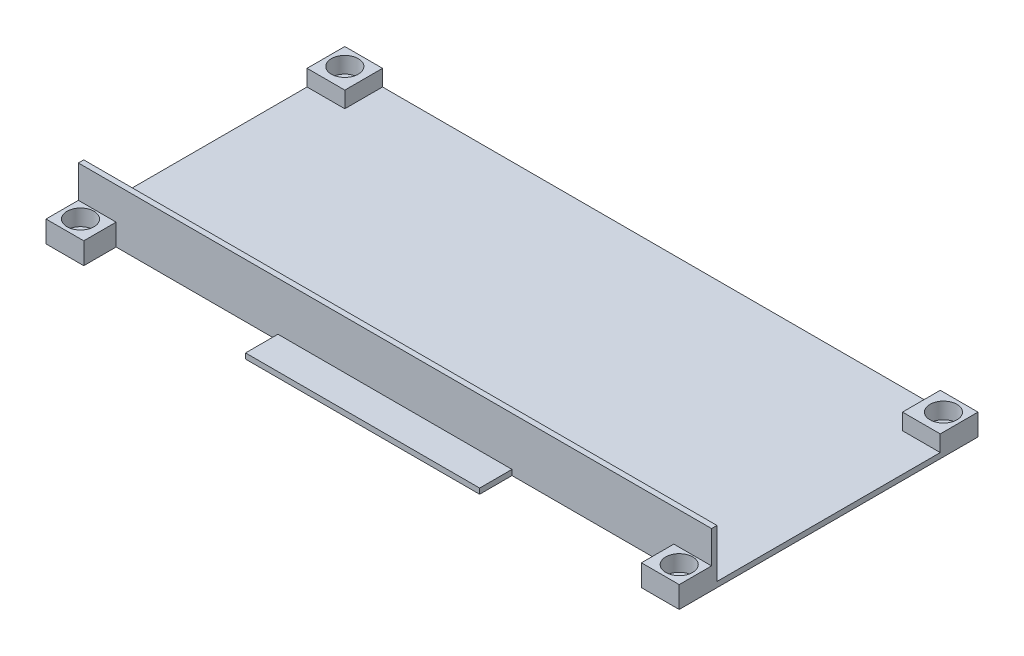
ISO-10303-21;
HEADER;
FILE_DESCRIPTION(('STEP AP214'),'2;1');
FILE_NAME('part.step','',(''),(''),'','','');
FILE_SCHEMA(('AUTOMOTIVE_DESIGN { 1 0 10303 214 1 1 1 1 }'));
ENDSEC;
DATA;
#1=APPLICATION_CONTEXT('core data for automotive mechanical design processes');
#2=APPLICATION_PROTOCOL_DEFINITION('international standard','automotive_design',2000,#1);
#3=PRODUCT_CONTEXT('',#1,'mechanical');
#4=PRODUCT('Part','Part','',(#3));
#5=PRODUCT_RELATED_PRODUCT_CATEGORY('part','',(#4));
#6=PRODUCT_DEFINITION_FORMATION('','',#4);
#7=PRODUCT_DEFINITION_CONTEXT('part definition',#1,'design');
#8=PRODUCT_DEFINITION('design','',#6,#7);
#9=PRODUCT_DEFINITION_SHAPE('','',#8);
#10=(LENGTH_UNIT() NAMED_UNIT(*) SI_UNIT(.MILLI.,.METRE.));
#11=(NAMED_UNIT(*) PLANE_ANGLE_UNIT() SI_UNIT($,.RADIAN.));
#12=(NAMED_UNIT(*) SI_UNIT($,.STERADIAN.) SOLID_ANGLE_UNIT());
#13=UNCERTAINTY_MEASURE_WITH_UNIT(LENGTH_MEASURE(1.E-05),#10,'distance_accuracy_value','');
#14=(GEOMETRIC_REPRESENTATION_CONTEXT(3) GLOBAL_UNCERTAINTY_ASSIGNED_CONTEXT((#13)) GLOBAL_UNIT_ASSIGNED_CONTEXT((#10,
#11,#12)) REPRESENTATION_CONTEXT('',''));
#15=CARTESIAN_POINT('',(0.,0.,0.));
#16=DIRECTION('',(0.,0.,1.));
#17=DIRECTION('',(1.,0.,0.));
#18=AXIS2_PLACEMENT_3D('',#15,#16,#17);
#19=CARTESIAN_POINT('',(0.,1.,0.));
#20=DIRECTION('',(0.,-1.,0.));
#21=DIRECTION('',(0.,0.,-1.));
#22=AXIS2_PLACEMENT_3D('',#19,#20,#21);
#23=PLANE('',#22);
#24=DIRECTION('',(0.,0.,1.));
#25=VECTOR('',#24,1.);
#26=CARTESIAN_POINT('',(-58.7,1.,27.7));
#27=LINE('',#26,#25);
#28=CARTESIAN_POINT('',(-58.7,1.,-20.7));
#29=VERTEX_POINT('',#28);
#30=CARTESIAN_POINT('',(-58.7,1.,20.7));
#31=VERTEX_POINT('',#30);
#32=EDGE_CURVE('E440',#29,#31,#27,.T.);
#33=ORIENTED_EDGE('',*,*,#32,.T.);
#34=DIRECTION('',(-1.,0.,0.));
#35=VECTOR('',#34,1.);
#36=CARTESIAN_POINT('',(58.7,1.,20.7));
#37=LINE('',#36,#35);
#38=CARTESIAN_POINT('',(58.7,1.,20.7));
#39=VERTEX_POINT('',#38);
#40=EDGE_CURVE('E356',#39,#31,#37,.T.);
#41=ORIENTED_EDGE('',*,*,#40,.F.);
#42=DIRECTION('',(0.,0.,-1.));
#43=VECTOR('',#42,1.);
#44=CARTESIAN_POINT('',(58.7,1.,27.7));
#45=LINE('',#44,#43);
#46=CARTESIAN_POINT('',(58.7,1.,-20.7));
#47=VERTEX_POINT('',#46);
#48=EDGE_CURVE('E201',#39,#47,#45,.T.);
#49=ORIENTED_EDGE('',*,*,#48,.T.);
#50=DIRECTION('',(1.,0.,0.));
#51=VECTOR('',#50,1.);
#52=CARTESIAN_POINT('',(58.7,1.,-20.7));
#53=LINE('',#52,#51);
#54=CARTESIAN_POINT('',(51.7,1.,-20.7));
#55=VERTEX_POINT('',#54);
#56=EDGE_CURVE('E374',#55,#47,#53,.T.);
#57=ORIENTED_EDGE('',*,*,#56,.F.);
#58=DIRECTION('',(0.,0.,1.));
#59=VECTOR('',#58,1.);
#60=CARTESIAN_POINT('',(51.7,1.,-27.7));
#61=LINE('',#60,#59);
#62=CARTESIAN_POINT('',(51.7,1.,-27.7));
#63=VERTEX_POINT('',#62);
#64=EDGE_CURVE('E204',#63,#55,#61,.T.);
#65=ORIENTED_EDGE('',*,*,#64,.F.);
#66=DIRECTION('',(-1.,0.,0.));
#67=VECTOR('',#66,1.);
#68=CARTESIAN_POINT('',(-58.7,1.,-27.7));
#69=LINE('',#68,#67);
#70=CARTESIAN_POINT('',(-51.7,1.,-27.7));
#71=VERTEX_POINT('',#70);
#72=EDGE_CURVE('E436',#63,#71,#69,.T.);
#73=ORIENTED_EDGE('',*,*,#72,.T.);
#74=DIRECTION('',(0.,0.,-1.));
#75=VECTOR('',#74,1.);
#76=CARTESIAN_POINT('',(-51.7,1.,-27.7));
#77=LINE('',#76,#75);
#78=CARTESIAN_POINT('',(-51.7,1.,-20.7));
#79=VERTEX_POINT('',#78);
#80=EDGE_CURVE('E406',#79,#71,#77,.T.);
#81=ORIENTED_EDGE('',*,*,#80,.F.);
#82=DIRECTION('',(1.,0.,0.));
#83=VECTOR('',#82,1.);
#84=CARTESIAN_POINT('',(-58.7,1.,-20.7));
#85=LINE('',#84,#83);
#86=EDGE_CURVE('E400',#29,#79,#85,.T.);
#87=ORIENTED_EDGE('',*,*,#86,.F.);
#88=EDGE_LOOP('',(#33,#41,#49,#57,#65,#73,#81,#87));
#89=FACE_BOUND('',#88,.T.);
#90=ADVANCED_FACE('F43',(#89),#23,.F.);
#91=DIRECTION('',(1.,0.,0.));
#92=VECTOR('',#91,1.);
#93=CARTESIAN_POINT('',(58.7,1.,21.7));
#94=LINE('',#93,#92);
#95=CARTESIAN_POINT('',(-21.7,1.,21.7));
#96=VERTEX_POINT('',#95);
#97=CARTESIAN_POINT('',(21.7,1.,21.7));
#98=VERTEX_POINT('',#97);
#99=EDGE_CURVE('E222',#96,#98,#94,.T.);
#100=ORIENTED_EDGE('',*,*,#99,.F.);
#101=DIRECTION('',(0.,0.,1.));
#102=VECTOR('',#101,1.);
#103=CARTESIAN_POINT('',(-21.7,1.,0.));
#104=LINE('',#103,#102);
#105=CARTESIAN_POINT('',(-21.7,1.,27.7));
#106=VERTEX_POINT('',#105);
#107=EDGE_CURVE('E291',#96,#106,#104,.T.);
#108=ORIENTED_EDGE('',*,*,#107,.T.);
#109=DIRECTION('',(1.,0.,0.));
#110=VECTOR('',#109,1.);
#111=CARTESIAN_POINT('',(-58.7,1.,27.7));
#112=LINE('',#111,#110);
#113=CARTESIAN_POINT('',(21.7,1.,27.7));
#114=VERTEX_POINT('',#113);
#115=EDGE_CURVE('E444',#106,#114,#112,.T.);
#116=ORIENTED_EDGE('',*,*,#115,.T.);
#117=DIRECTION('',(0.,0.,-1.));
#118=VECTOR('',#117,1.);
#119=CARTESIAN_POINT('',(21.7,1.,0.));
#120=LINE('',#119,#118);
#121=EDGE_CURVE('E321',#114,#98,#120,.T.);
#122=ORIENTED_EDGE('',*,*,#121,.T.);
#123=EDGE_LOOP('',(#100,#108,#116,#122));
#124=FACE_BOUND('',#123,.T.);
#125=ADVANCED_FACE('F510',(#124),#23,.F.);
#126=CARTESIAN_POINT('',(51.7,4.,27.7));
#127=DIRECTION('',(1.,0.,0.));
#128=DIRECTION('',(0.,0.,-1.));
#129=AXIS2_PLACEMENT_3D('',#126,#127,#128);
#130=PLANE('',#129);
#131=DIRECTION('',(0.,0.,1.));
#132=VECTOR('',#131,1.);
#133=CARTESIAN_POINT('',(51.7,4.,27.7));
#134=LINE('',#133,#132);
#135=CARTESIAN_POINT('',(51.7,4.,21.7));
#136=VERTEX_POINT('',#135);
#137=CARTESIAN_POINT('',(51.7,4.,27.7));
#138=VERTEX_POINT('',#137);
#139=EDGE_CURVE('E362',#136,#138,#134,.T.);
#140=ORIENTED_EDGE('',*,*,#139,.F.);
#141=DIRECTION('',(0.,-1.,0.));
#142=VECTOR('',#141,1.);
#143=CARTESIAN_POINT('',(51.7,4.,21.7));
#144=LINE('',#143,#142);
#145=CARTESIAN_POINT('',(51.7,0.,21.7));
#146=VERTEX_POINT('',#145);
#147=EDGE_CURVE('E59',#136,#146,#144,.T.);
#148=ORIENTED_EDGE('',*,*,#147,.T.);
#149=DIRECTION('',(0.,0.,1.));
#150=VECTOR('',#149,1.);
#151=CARTESIAN_POINT('',(51.7,0.,27.7));
#152=LINE('',#151,#150);
#153=CARTESIAN_POINT('',(51.7,0.,27.7));
#154=VERTEX_POINT('',#153);
#155=EDGE_CURVE('E276',#146,#154,#152,.T.);
#156=ORIENTED_EDGE('',*,*,#155,.T.);
#157=DIRECTION('',(0.,-1.,0.));
#158=VECTOR('',#157,1.);
#159=CARTESIAN_POINT('',(51.7,4.,27.7));
#160=LINE('',#159,#158);
#161=EDGE_CURVE('E205',#138,#154,#160,.T.);
#162=ORIENTED_EDGE('',*,*,#161,.F.);
#163=EDGE_LOOP('',(#140,#148,#156,#162));
#164=FACE_BOUND('',#163,.T.);
#165=ADVANCED_FACE('F515',(#164),#130,.F.);
#166=CARTESIAN_POINT('',(0.,4.,0.));
#167=DIRECTION('',(0.,-1.,0.));
#168=DIRECTION('',(0.,0.,-1.));
#169=AXIS2_PLACEMENT_3D('',#166,#167,#168);
#170=PLANE('',#169);
#171=CARTESIAN_POINT('',(55.5,4.,24.5));
#172=DIRECTION('',(0.,1.,0.));
#173=DIRECTION('',(0.,0.,1.));
#174=AXIS2_PLACEMENT_3D('',#171,#172,#173);
#175=CIRCLE('',#174,2.5);
#176=CARTESIAN_POINT('',(55.5,4.,27.));
#177=VERTEX_POINT('',#176);
#178=EDGE_CURVE('E255',#177,#177,#175,.T.);
#179=ORIENTED_EDGE('',*,*,#178,.F.);
#180=EDGE_LOOP('',(#179));
#181=FACE_BOUND('',#180,.T.);
#182=DIRECTION('',(1.,0.,0.));
#183=VECTOR('',#182,1.);
#184=CARTESIAN_POINT('',(0.,4.,21.7));
#185=LINE('',#184,#183);
#186=CARTESIAN_POINT('',(58.7,4.,21.7));
#187=VERTEX_POINT('',#186);
#188=EDGE_CURVE('E241',#136,#187,#185,.T.);
#189=ORIENTED_EDGE('',*,*,#188,.F.);
#190=ORIENTED_EDGE('',*,*,#139,.T.);
#191=DIRECTION('',(1.,0.,0.));
#192=VECTOR('',#191,1.);
#193=CARTESIAN_POINT('',(58.7,4.,27.7));
#194=LINE('',#193,#192);
#195=CARTESIAN_POINT('',(58.7,4.,27.7));
#196=VERTEX_POINT('',#195);
#197=EDGE_CURVE('E357',#138,#196,#194,.T.);
#198=ORIENTED_EDGE('',*,*,#197,.T.);
#199=DIRECTION('',(0.,0.,-1.));
#200=VECTOR('',#199,1.);
#201=CARTESIAN_POINT('',(58.7,4.,27.7));
#202=LINE('',#201,#200);
#203=EDGE_CURVE('E66',#196,#187,#202,.T.);
#204=ORIENTED_EDGE('',*,*,#203,.T.);
#205=EDGE_LOOP('',(#189,#190,#198,#204));
#206=FACE_BOUND('',#205,.T.);
#207=ADVANCED_FACE('F559',(#181,#206),#170,.F.);
#208=CARTESIAN_POINT('',(-51.7,4.,27.7));
#209=DIRECTION('',(-1.,0.,0.));
#210=DIRECTION('',(0.,0.,1.));
#211=AXIS2_PLACEMENT_3D('',#208,#209,#210);
#212=PLANE('',#211);
#213=DIRECTION('',(0.,-1.,0.));
#214=VECTOR('',#213,1.);
#215=CARTESIAN_POINT('',(-51.7,4.,21.7));
#216=LINE('',#215,#214);
#217=CARTESIAN_POINT('',(-51.7,4.,21.7));
#218=VERTEX_POINT('',#217);
#219=CARTESIAN_POINT('',(-51.7,0.,21.7));
#220=VERTEX_POINT('',#219);
#221=EDGE_CURVE('E309',#218,#220,#216,.T.);
#222=ORIENTED_EDGE('',*,*,#221,.F.);
#223=DIRECTION('',(0.,0.,-1.));
#224=VECTOR('',#223,1.);
#225=CARTESIAN_POINT('',(-51.7,4.,27.7));
#226=LINE('',#225,#224);
#227=CARTESIAN_POINT('',(-51.7,4.,27.7));
#228=VERTEX_POINT('',#227);
#229=EDGE_CURVE('E347',#228,#218,#226,.T.);
#230=ORIENTED_EDGE('',*,*,#229,.F.);
#231=DIRECTION('',(0.,-1.,0.));
#232=VECTOR('',#231,1.);
#233=CARTESIAN_POINT('',(-51.7,4.,27.7));
#234=LINE('',#233,#232);
#235=CARTESIAN_POINT('',(-51.7,0.,27.7));
#236=VERTEX_POINT('',#235);
#237=EDGE_CURVE('E353',#228,#236,#234,.T.);
#238=ORIENTED_EDGE('',*,*,#237,.T.);
#239=DIRECTION('',(0.,0.,-1.));
#240=VECTOR('',#239,1.);
#241=CARTESIAN_POINT('',(-51.7,0.,27.7));
#242=LINE('',#241,#240);
#243=EDGE_CURVE('E297',#236,#220,#242,.T.);
#244=ORIENTED_EDGE('',*,*,#243,.T.);
#245=EDGE_LOOP('',(#222,#230,#238,#244));
#246=FACE_BOUND('',#245,.T.);
#247=ADVANCED_FACE('F604',(#246),#212,.F.);
#248=CARTESIAN_POINT('',(0.,4.,0.));
#249=DIRECTION('',(0.,-1.,0.));
#250=DIRECTION('',(0.,0.,-1.));
#251=AXIS2_PLACEMENT_3D('',#248,#249,#250);
#252=PLANE('',#251);
#253=CARTESIAN_POINT('',(-55.5,4.,24.5));
#254=DIRECTION('',(0.,1.,0.));
#255=DIRECTION('',(0.,0.,1.));
#256=AXIS2_PLACEMENT_3D('',#253,#254,#255);
#257=CIRCLE('',#256,2.5);
#258=CARTESIAN_POINT('',(-55.5,4.,27.));
#259=VERTEX_POINT('',#258);
#260=EDGE_CURVE('E244',#259,#259,#257,.T.);
#261=ORIENTED_EDGE('',*,*,#260,.F.);
#262=EDGE_LOOP('',(#261));
#263=FACE_BOUND('',#262,.T.);
#264=DIRECTION('',(1.,0.,0.));
#265=VECTOR('',#264,1.);
#266=CARTESIAN_POINT('',(0.,4.,21.7));
#267=LINE('',#266,#265);
#268=CARTESIAN_POINT('',(-58.7,4.,21.7));
#269=VERTEX_POINT('',#268);
#270=EDGE_CURVE('E12',#269,#218,#267,.T.);
#271=ORIENTED_EDGE('',*,*,#270,.F.);
#272=DIRECTION('',(0.,0.,1.));
#273=VECTOR('',#272,1.);
#274=CARTESIAN_POINT('',(-58.7,4.,27.7));
#275=LINE('',#274,#273);
#276=CARTESIAN_POINT('',(-58.7,4.,27.7));
#277=VERTEX_POINT('',#276);
#278=EDGE_CURVE('E341',#269,#277,#275,.T.);
#279=ORIENTED_EDGE('',*,*,#278,.T.);
#280=DIRECTION('',(1.,0.,0.));
#281=VECTOR('',#280,1.);
#282=CARTESIAN_POINT('',(-58.7,4.,27.7));
#283=LINE('',#282,#281);
#284=EDGE_CURVE('E344',#277,#228,#283,.T.);
#285=ORIENTED_EDGE('',*,*,#284,.T.);
#286=ORIENTED_EDGE('',*,*,#229,.T.);
#287=EDGE_LOOP('',(#271,#279,#285,#286));
#288=FACE_BOUND('',#287,.T.);
#289=ADVANCED_FACE('F601',(#263,#288),#252,.F.);
#290=CARTESIAN_POINT('',(-58.7,1.,27.7));
#291=DIRECTION('',(0.,0.,-1.));
#292=DIRECTION('',(-1.,0.,0.));
#293=AXIS2_PLACEMENT_3D('',#290,#291,#292);
#294=PLANE('',#293);
#295=ORIENTED_EDGE('',*,*,#161,.T.);
#296=DIRECTION('',(1.,0.,0.));
#297=VECTOR('',#296,1.);
#298=CARTESIAN_POINT('',(-58.7,0.,27.7));
#299=LINE('',#298,#297);
#300=CARTESIAN_POINT('',(58.7,0.,27.7));
#301=VERTEX_POINT('',#300);
#302=EDGE_CURVE('E458',#154,#301,#299,.T.);
#303=ORIENTED_EDGE('',*,*,#302,.T.);
#304=DIRECTION('',(0.,-1.,0.));
#305=VECTOR('',#304,1.);
#306=CARTESIAN_POINT('',(58.7,1.,27.7));
#307=LINE('',#306,#305);
#308=EDGE_CURVE('E448',#196,#301,#307,.T.);
#309=ORIENTED_EDGE('',*,*,#308,.F.);
#310=ORIENTED_EDGE('',*,*,#197,.F.);
#311=EDGE_LOOP('',(#295,#303,#309,#310));
#312=FACE_BOUND('',#311,.T.);
#313=ADVANCED_FACE('F530',(#312),#294,.F.);
#314=CARTESIAN_POINT('',(-21.7,0.,27.7));
#315=VERTEX_POINT('',#314);
#316=CARTESIAN_POINT('',(21.7,0.,27.7));
#317=VERTEX_POINT('',#316);
#318=EDGE_CURVE('E462',#315,#317,#299,.T.);
#319=ORIENTED_EDGE('',*,*,#318,.T.);
#320=DIRECTION('',(0.,-1.,0.));
#321=VECTOR('',#320,1.);
#322=CARTESIAN_POINT('',(21.7,4.,27.7));
#323=LINE('',#322,#321);
#324=EDGE_CURVE('E288',#114,#317,#323,.T.);
#325=ORIENTED_EDGE('',*,*,#324,.F.);
#326=ORIENTED_EDGE('',*,*,#115,.F.);
#327=DIRECTION('',(0.,-1.,0.));
#328=VECTOR('',#327,1.);
#329=CARTESIAN_POINT('',(-21.7,4.,27.7));
#330=LINE('',#329,#328);
#331=EDGE_CURVE('E281',#106,#315,#330,.T.);
#332=ORIENTED_EDGE('',*,*,#331,.T.);
#333=EDGE_LOOP('',(#319,#325,#326,#332));
#334=FACE_BOUND('',#333,.T.);
#335=ADVANCED_FACE('F531',(#334),#294,.F.);
#336=CARTESIAN_POINT('',(58.7,1.,27.7));
#337=DIRECTION('',(-1.,0.,0.));
#338=DIRECTION('',(0.,0.,1.));
#339=AXIS2_PLACEMENT_3D('',#336,#337,#338);
#340=PLANE('',#339);
#341=DIRECTION('',(0.,-1.,0.));
#342=VECTOR('',#341,1.);
#343=CARTESIAN_POINT('',(58.7,4.,20.7));
#344=LINE('',#343,#342);
#345=CARTESIAN_POINT('',(58.7,10.,20.7));
#346=VERTEX_POINT('',#345);
#347=EDGE_CURVE('E195',#346,#39,#344,.T.);
#348=ORIENTED_EDGE('',*,*,#347,.F.);
#349=DIRECTION('',(0.,0.,-1.));
#350=VECTOR('',#349,1.);
#351=CARTESIAN_POINT('',(58.7,10.,21.7));
#352=LINE('',#351,#350);
#353=CARTESIAN_POINT('',(58.7,10.,21.7));
#354=VERTEX_POINT('',#353);
#355=EDGE_CURVE('E199',#354,#346,#352,.T.);
#356=ORIENTED_EDGE('',*,*,#355,.F.);
#357=DIRECTION('',(0.,-1.,0.));
#358=VECTOR('',#357,1.);
#359=CARTESIAN_POINT('',(58.7,10.,21.7));
#360=LINE('',#359,#358);
#361=EDGE_CURVE('E233',#354,#187,#360,.T.);
#362=ORIENTED_EDGE('',*,*,#361,.T.);
#363=ORIENTED_EDGE('',*,*,#203,.F.);
#364=ORIENTED_EDGE('',*,*,#308,.T.);
#365=DIRECTION('',(0.,0.,-1.));
#366=VECTOR('',#365,1.);
#367=CARTESIAN_POINT('',(58.7,0.,27.7));
#368=LINE('',#367,#366);
#369=CARTESIAN_POINT('',(58.7,0.,-27.7));
#370=VERTEX_POINT('',#369);
#371=EDGE_CURVE('E433',#301,#370,#368,.T.);
#372=ORIENTED_EDGE('',*,*,#371,.T.);
#373=DIRECTION('',(0.,-1.,0.));
#374=VECTOR('',#373,1.);
#375=CARTESIAN_POINT('',(58.7,1.,-27.7));
#376=LINE('',#375,#374);
#377=CARTESIAN_POINT('',(58.7,4.,-27.7));
#378=VERTEX_POINT('',#377);
#379=EDGE_CURVE('E52',#378,#370,#376,.T.);
#380=ORIENTED_EDGE('',*,*,#379,.F.);
#381=DIRECTION('',(0.,0.,-1.));
#382=VECTOR('',#381,1.);
#383=CARTESIAN_POINT('',(58.7,4.,-27.7));
#384=LINE('',#383,#382);
#385=CARTESIAN_POINT('',(58.7,4.,-20.7));
#386=VERTEX_POINT('',#385);
#387=EDGE_CURVE('E369',#386,#378,#384,.T.);
#388=ORIENTED_EDGE('',*,*,#387,.F.);
#389=DIRECTION('',(0.,-1.,0.));
#390=VECTOR('',#389,1.);
#391=CARTESIAN_POINT('',(58.7,4.,-20.7));
#392=LINE('',#391,#390);
#393=EDGE_CURVE('E383',#386,#47,#392,.T.);
#394=ORIENTED_EDGE('',*,*,#393,.T.);
#395=ORIENTED_EDGE('',*,*,#48,.F.);
#396=EDGE_LOOP('',(#348,#356,#362,#363,#364,#372,#380,#388,#394,#395));
#397=FACE_BOUND('',#396,.T.);
#398=ADVANCED_FACE('F45',(#397),#340,.F.);
#399=CARTESIAN_POINT('',(-58.7,1.,-27.7));
#400=DIRECTION('',(0.,0.,1.));
#401=DIRECTION('',(1.,0.,0.));
#402=AXIS2_PLACEMENT_3D('',#399,#400,#401);
#403=PLANE('',#402);
#404=DIRECTION('',(-1.,0.,0.));
#405=VECTOR('',#404,1.);
#406=CARTESIAN_POINT('',(-58.7,0.,-27.7));
#407=LINE('',#406,#405);
#408=CARTESIAN_POINT('',(-58.7,0.,-27.7));
#409=VERTEX_POINT('',#408);
#410=EDGE_CURVE('E452',#370,#409,#407,.T.);
#411=ORIENTED_EDGE('',*,*,#410,.T.);
#412=DIRECTION('',(0.,-1.,0.));
#413=VECTOR('',#412,1.);
#414=CARTESIAN_POINT('',(-58.7,1.,-27.7));
#415=LINE('',#414,#413);
#416=CARTESIAN_POINT('',(-58.7,4.,-27.7));
#417=VERTEX_POINT('',#416);
#418=EDGE_CURVE('E470',#417,#409,#415,.T.);
#419=ORIENTED_EDGE('',*,*,#418,.F.);
#420=DIRECTION('',(-1.,0.,0.));
#421=VECTOR('',#420,1.);
#422=CARTESIAN_POINT('',(-58.7,4.,-27.7));
#423=LINE('',#422,#421);
#424=CARTESIAN_POINT('',(-51.7,4.,-27.7));
#425=VERTEX_POINT('',#424);
#426=EDGE_CURVE('E411',#425,#417,#423,.T.);
#427=ORIENTED_EDGE('',*,*,#426,.F.);
#428=DIRECTION('',(0.,-1.,0.));
#429=VECTOR('',#428,1.);
#430=CARTESIAN_POINT('',(-51.7,4.,-27.7));
#431=LINE('',#430,#429);
#432=EDGE_CURVE('E415',#425,#71,#431,.T.);
#433=ORIENTED_EDGE('',*,*,#432,.T.);
#434=ORIENTED_EDGE('',*,*,#72,.F.);
#435=DIRECTION('',(0.,-1.,0.));
#436=VECTOR('',#435,1.);
#437=CARTESIAN_POINT('',(51.7,4.,-27.7));
#438=LINE('',#437,#436);
#439=CARTESIAN_POINT('',(51.7,4.,-27.7));
#440=VERTEX_POINT('',#439);
#441=EDGE_CURVE('E396',#440,#63,#438,.T.);
#442=ORIENTED_EDGE('',*,*,#441,.F.);
#443=DIRECTION('',(-1.,0.,0.));
#444=VECTOR('',#443,1.);
#445=CARTESIAN_POINT('',(58.7,4.,-27.7));
#446=LINE('',#445,#444);
#447=EDGE_CURVE('E373',#378,#440,#446,.T.);
#448=ORIENTED_EDGE('',*,*,#447,.F.);
#449=ORIENTED_EDGE('',*,*,#379,.T.);
#450=EDGE_LOOP('',(#411,#419,#427,#433,#434,#442,#448,#449));
#451=FACE_BOUND('',#450,.T.);
#452=ADVANCED_FACE('F533',(#451),#403,.F.);
#453=CARTESIAN_POINT('',(-58.7,1.,27.7));
#454=DIRECTION('',(1.,0.,0.));
#455=DIRECTION('',(0.,0.,-1.));
#456=AXIS2_PLACEMENT_3D('',#453,#454,#455);
#457=PLANE('',#456);
#458=ORIENTED_EDGE('',*,*,#278,.F.);
#459=DIRECTION('',(0.,-1.,0.));
#460=VECTOR('',#459,1.);
#461=CARTESIAN_POINT('',(-58.7,10.,21.7));
#462=LINE('',#461,#460);
#463=CARTESIAN_POINT('',(-58.7,10.,21.7));
#464=VERTEX_POINT('',#463);
#465=EDGE_CURVE('E237',#464,#269,#462,.T.);
#466=ORIENTED_EDGE('',*,*,#465,.F.);
#467=DIRECTION('',(0.,0.,1.));
#468=VECTOR('',#467,1.);
#469=CARTESIAN_POINT('',(-58.7,10.,21.7));
#470=LINE('',#469,#468);
#471=CARTESIAN_POINT('',(-58.7,10.,20.7));
#472=VERTEX_POINT('',#471);
#473=EDGE_CURVE('E215',#472,#464,#470,.T.);
#474=ORIENTED_EDGE('',*,*,#473,.F.);
#475=DIRECTION('',(0.,-1.,0.));
#476=VECTOR('',#475,1.);
#477=CARTESIAN_POINT('',(-58.7,4.,20.7));
#478=LINE('',#477,#476);
#479=EDGE_CURVE('E211',#472,#31,#478,.T.);
#480=ORIENTED_EDGE('',*,*,#479,.T.);
#481=ORIENTED_EDGE('',*,*,#32,.F.);
#482=DIRECTION('',(0.,-1.,0.));
#483=VECTOR('',#482,1.);
#484=CARTESIAN_POINT('',(-58.7,4.,-20.7));
#485=LINE('',#484,#483);
#486=CARTESIAN_POINT('',(-58.7,4.,-20.7));
#487=VERTEX_POINT('',#486);
#488=EDGE_CURVE('E429',#487,#29,#485,.T.);
#489=ORIENTED_EDGE('',*,*,#488,.F.);
#490=DIRECTION('',(0.,0.,1.));
#491=VECTOR('',#490,1.);
#492=CARTESIAN_POINT('',(-58.7,4.,-27.7));
#493=LINE('',#492,#491);
#494=EDGE_CURVE('E401',#417,#487,#493,.T.);
#495=ORIENTED_EDGE('',*,*,#494,.F.);
#496=ORIENTED_EDGE('',*,*,#418,.T.);
#497=DIRECTION('',(0.,0.,1.));
#498=VECTOR('',#497,1.);
#499=CARTESIAN_POINT('',(-58.7,0.,27.7));
#500=LINE('',#499,#498);
#501=CARTESIAN_POINT('',(-58.7,0.,27.7));
#502=VERTEX_POINT('',#501);
#503=EDGE_CURVE('E455',#409,#502,#500,.T.);
#504=ORIENTED_EDGE('',*,*,#503,.T.);
#505=DIRECTION('',(0.,-1.,0.));
#506=VECTOR('',#505,1.);
#507=CARTESIAN_POINT('',(-58.7,1.,27.7));
#508=LINE('',#507,#506);
#509=EDGE_CURVE('E466',#277,#502,#508,.T.);
#510=ORIENTED_EDGE('',*,*,#509,.F.);
#511=EDGE_LOOP('',(#458,#466,#474,#480,#481,#489,#495,#496,#504,#510));
#512=FACE_BOUND('',#511,.T.);
#513=ADVANCED_FACE('F528',(#512),#457,.F.);
#514=EDGE_CURVE('E437',#502,#236,#299,.T.);
#515=ORIENTED_EDGE('',*,*,#514,.T.);
#516=ORIENTED_EDGE('',*,*,#237,.F.);
#517=ORIENTED_EDGE('',*,*,#284,.F.);
#518=ORIENTED_EDGE('',*,*,#509,.T.);
#519=EDGE_LOOP('',(#515,#516,#517,#518));
#520=FACE_BOUND('',#519,.T.);
#521=ADVANCED_FACE('F524',(#520),#294,.F.);
#522=CARTESIAN_POINT('',(0.,0.,0.));
#523=DIRECTION('',(0.,-1.,0.));
#524=DIRECTION('',(0.,0.,-1.));
#525=AXIS2_PLACEMENT_3D('',#522,#523,#524);
#526=PLANE('',#525);
#527=ORIENTED_EDGE('',*,*,#155,.F.);
#528=DIRECTION('',(1.,0.,0.));
#529=VECTOR('',#528,1.);
#530=CARTESIAN_POINT('',(51.7,0.,21.7));
#531=LINE('',#530,#529);
#532=CARTESIAN_POINT('',(21.7,0.,21.7));
#533=VERTEX_POINT('',#532);
#534=EDGE_CURVE('E285',#533,#146,#531,.T.);
#535=ORIENTED_EDGE('',*,*,#534,.F.);
#536=DIRECTION('',(0.,0.,-1.));
#537=VECTOR('',#536,1.);
#538=CARTESIAN_POINT('',(21.7,0.,27.7));
#539=LINE('',#538,#537);
#540=EDGE_CURVE('E280',#317,#533,#539,.T.);
#541=ORIENTED_EDGE('',*,*,#540,.F.);
#542=ORIENTED_EDGE('',*,*,#318,.F.);
#543=DIRECTION('',(0.,0.,1.));
#544=VECTOR('',#543,1.);
#545=CARTESIAN_POINT('',(-21.7,0.,27.7));
#546=LINE('',#545,#544);
#547=CARTESIAN_POINT('',(-21.7,0.,21.7));
#548=VERTEX_POINT('',#547);
#549=EDGE_CURVE('E306',#548,#315,#546,.T.);
#550=ORIENTED_EDGE('',*,*,#549,.F.);
#551=DIRECTION('',(1.,0.,0.));
#552=VECTOR('',#551,1.);
#553=CARTESIAN_POINT('',(-51.7,0.,21.7));
#554=LINE('',#553,#552);
#555=EDGE_CURVE('E301',#220,#548,#554,.T.);
#556=ORIENTED_EDGE('',*,*,#555,.F.);
#557=ORIENTED_EDGE('',*,*,#243,.F.);
#558=ORIENTED_EDGE('',*,*,#514,.F.);
#559=ORIENTED_EDGE('',*,*,#503,.F.);
#560=ORIENTED_EDGE('',*,*,#410,.F.);
#561=ORIENTED_EDGE('',*,*,#371,.F.);
#562=ORIENTED_EDGE('',*,*,#302,.F.);
#563=EDGE_LOOP('',(#527,#535,#541,#542,#550,#556,#557,#558,#559,#560,#561,#562));
#564=FACE_BOUND('',#563,.T.);
#565=CARTESIAN_POINT('',(-55.5,0.,24.5));
#566=DIRECTION('',(0.,1.,0.));
#567=DIRECTION('',(0.,0.,1.));
#568=AXIS2_PLACEMENT_3D('',#565,#566,#567);
#569=CIRCLE('',#568,1.35);
#570=CARTESIAN_POINT('',(-55.5,0.,25.85));
#571=VERTEX_POINT('',#570);
#572=EDGE_CURVE('E325',#571,#571,#569,.T.);
#573=ORIENTED_EDGE('',*,*,#572,.T.);
#574=EDGE_LOOP('',(#573));
#575=FACE_BOUND('',#574,.T.);
#576=CARTESIAN_POINT('',(55.5,0.,24.5));
#577=DIRECTION('',(0.,1.,0.));
#578=DIRECTION('',(0.,0.,1.));
#579=AXIS2_PLACEMENT_3D('',#576,#577,#578);
#580=CIRCLE('',#579,1.35);
#581=CARTESIAN_POINT('',(55.5,0.,25.85));
#582=VERTEX_POINT('',#581);
#583=EDGE_CURVE('E331',#582,#582,#580,.T.);
#584=ORIENTED_EDGE('',*,*,#583,.T.);
#585=EDGE_LOOP('',(#584));
#586=FACE_BOUND('',#585,.T.);
#587=CARTESIAN_POINT('',(55.5,0.,-24.5));
#588=DIRECTION('',(0.,1.,0.));
#589=DIRECTION('',(0.,0.,1.));
#590=AXIS2_PLACEMENT_3D('',#587,#588,#589);
#591=CIRCLE('',#590,1.35);
#592=CARTESIAN_POINT('',(55.5,0.,-23.15));
#593=VERTEX_POINT('',#592);
#594=EDGE_CURVE('E326',#593,#593,#591,.T.);
#595=ORIENTED_EDGE('',*,*,#594,.T.);
#596=EDGE_LOOP('',(#595));
#597=FACE_BOUND('',#596,.T.);
#598=CARTESIAN_POINT('',(-55.5,0.,-24.5));
#599=DIRECTION('',(0.,1.,0.));
#600=DIRECTION('',(0.,0.,1.));
#601=AXIS2_PLACEMENT_3D('',#598,#599,#600);
#602=CIRCLE('',#601,1.35);
#603=CARTESIAN_POINT('',(-55.5,0.,-23.15));
#604=VERTEX_POINT('',#603);
#605=EDGE_CURVE('E330',#604,#604,#602,.T.);
#606=ORIENTED_EDGE('',*,*,#605,.T.);
#607=EDGE_LOOP('',(#606));
#608=FACE_BOUND('',#607,.T.);
#609=ADVANCED_FACE('F521',(#564,#575,#586,#597,#608),#526,.T.);
#610=CARTESIAN_POINT('',(-58.7,4.,-20.7));
#611=DIRECTION('',(0.,0.,-1.));
#612=DIRECTION('',(-1.,0.,0.));
#613=AXIS2_PLACEMENT_3D('',#610,#611,#612);
#614=PLANE('',#613);
#615=ORIENTED_EDGE('',*,*,#86,.T.);
#616=DIRECTION('',(0.,-1.,0.));
#617=VECTOR('',#616,1.);
#618=CARTESIAN_POINT('',(-51.7,4.,-20.7));
#619=LINE('',#618,#617);
#620=CARTESIAN_POINT('',(-51.7,4.,-20.7));
#621=VERTEX_POINT('',#620);
#622=EDGE_CURVE('E425',#621,#79,#619,.T.);
#623=ORIENTED_EDGE('',*,*,#622,.F.);
#624=DIRECTION('',(1.,0.,0.));
#625=VECTOR('',#624,1.);
#626=CARTESIAN_POINT('',(-58.7,4.,-20.7));
#627=LINE('',#626,#625);
#628=EDGE_CURVE('E405',#487,#621,#627,.T.);
#629=ORIENTED_EDGE('',*,*,#628,.F.);
#630=ORIENTED_EDGE('',*,*,#488,.T.);
#631=EDGE_LOOP('',(#615,#623,#629,#630));
#632=FACE_BOUND('',#631,.T.);
#633=ADVANCED_FACE('F519',(#632),#614,.F.);
#634=CARTESIAN_POINT('',(-51.7,4.,-27.7));
#635=DIRECTION('',(-1.,0.,0.));
#636=DIRECTION('',(0.,0.,1.));
#637=AXIS2_PLACEMENT_3D('',#634,#635,#636);
#638=PLANE('',#637);
#639=ORIENTED_EDGE('',*,*,#80,.T.);
#640=ORIENTED_EDGE('',*,*,#432,.F.);
#641=DIRECTION('',(0.,0.,-1.));
#642=VECTOR('',#641,1.);
#643=CARTESIAN_POINT('',(-51.7,4.,-27.7));
#644=LINE('',#643,#642);
#645=EDGE_CURVE('E408',#621,#425,#644,.T.);
#646=ORIENTED_EDGE('',*,*,#645,.F.);
#647=ORIENTED_EDGE('',*,*,#622,.T.);
#648=EDGE_LOOP('',(#639,#640,#646,#647));
#649=FACE_BOUND('',#648,.T.);
#650=ADVANCED_FACE('F631',(#649),#638,.F.);
#651=CARTESIAN_POINT('',(0.,4.,0.));
#652=DIRECTION('',(0.,1.,0.));
#653=DIRECTION('',(0.,0.,1.));
#654=AXIS2_PLACEMENT_3D('',#651,#652,#653);
#655=PLANE('',#654);
#656=CARTESIAN_POINT('',(-55.5,4.,-24.5));
#657=DIRECTION('',(0.,1.,0.));
#658=DIRECTION('',(0.,0.,1.));
#659=AXIS2_PLACEMENT_3D('',#656,#657,#658);
#660=CIRCLE('',#659,2.5);
#661=CARTESIAN_POINT('',(-55.5,4.,-22.));
#662=VERTEX_POINT('',#661);
#663=EDGE_CURVE('E254',#662,#662,#660,.T.);
#664=ORIENTED_EDGE('',*,*,#663,.F.);
#665=EDGE_LOOP('',(#664));
#666=FACE_BOUND('',#665,.T.);
#667=ORIENTED_EDGE('',*,*,#494,.T.);
#668=ORIENTED_EDGE('',*,*,#628,.T.);
#669=ORIENTED_EDGE('',*,*,#645,.T.);
#670=ORIENTED_EDGE('',*,*,#426,.T.);
#671=EDGE_LOOP('',(#667,#668,#669,#670));
#672=FACE_BOUND('',#671,.T.);
#673=ADVANCED_FACE('F628',(#666,#672),#655,.T.);
#674=CARTESIAN_POINT('',(51.7,4.,-27.7));
#675=DIRECTION('',(1.,0.,0.));
#676=DIRECTION('',(0.,0.,-1.));
#677=AXIS2_PLACEMENT_3D('',#674,#675,#676);
#678=PLANE('',#677);
#679=ORIENTED_EDGE('',*,*,#64,.T.);
#680=DIRECTION('',(0.,-1.,0.));
#681=VECTOR('',#680,1.);
#682=CARTESIAN_POINT('',(51.7,4.,-20.7));
#683=LINE('',#682,#681);
#684=CARTESIAN_POINT('',(51.7,4.,-20.7));
#685=VERTEX_POINT('',#684);
#686=EDGE_CURVE('E392',#685,#55,#683,.T.);
#687=ORIENTED_EDGE('',*,*,#686,.F.);
#688=DIRECTION('',(0.,0.,1.));
#689=VECTOR('',#688,1.);
#690=CARTESIAN_POINT('',(51.7,4.,-27.7));
#691=LINE('',#690,#689);
#692=EDGE_CURVE('E377',#440,#685,#691,.T.);
#693=ORIENTED_EDGE('',*,*,#692,.F.);
#694=ORIENTED_EDGE('',*,*,#441,.T.);
#695=EDGE_LOOP('',(#679,#687,#693,#694));
#696=FACE_BOUND('',#695,.T.);
#697=ADVANCED_FACE('F624',(#696),#678,.F.);
#698=CARTESIAN_POINT('',(58.7,4.,-20.7));
#699=DIRECTION('',(0.,0.,-1.));
#700=DIRECTION('',(-1.,0.,0.));
#701=AXIS2_PLACEMENT_3D('',#698,#699,#700);
#702=PLANE('',#701);
#703=ORIENTED_EDGE('',*,*,#56,.T.);
#704=ORIENTED_EDGE('',*,*,#393,.F.);
#705=DIRECTION('',(1.,0.,0.));
#706=VECTOR('',#705,1.);
#707=CARTESIAN_POINT('',(58.7,4.,-20.7));
#708=LINE('',#707,#706);
#709=EDGE_CURVE('E380',#685,#386,#708,.T.);
#710=ORIENTED_EDGE('',*,*,#709,.F.);
#711=ORIENTED_EDGE('',*,*,#686,.T.);
#712=EDGE_LOOP('',(#703,#704,#710,#711));
#713=FACE_BOUND('',#712,.T.);
#714=ADVANCED_FACE('F620',(#713),#702,.F.);
#715=CARTESIAN_POINT('',(0.,4.,0.));
#716=DIRECTION('',(0.,-1.,0.));
#717=DIRECTION('',(0.,0.,-1.));
#718=AXIS2_PLACEMENT_3D('',#715,#716,#717);
#719=PLANE('',#718);
#720=CARTESIAN_POINT('',(55.5,4.,-24.5));
#721=DIRECTION('',(0.,1.,0.));
#722=DIRECTION('',(0.,0.,1.));
#723=AXIS2_PLACEMENT_3D('',#720,#721,#722);
#724=CIRCLE('',#723,2.5);
#725=CARTESIAN_POINT('',(55.5,4.,-22.));
#726=VERTEX_POINT('',#725);
#727=EDGE_CURVE('E245',#726,#726,#724,.T.);
#728=ORIENTED_EDGE('',*,*,#727,.F.);
#729=EDGE_LOOP('',(#728));
#730=FACE_BOUND('',#729,.T.);
#731=ORIENTED_EDGE('',*,*,#387,.T.);
#732=ORIENTED_EDGE('',*,*,#447,.T.);
#733=ORIENTED_EDGE('',*,*,#692,.T.);
#734=ORIENTED_EDGE('',*,*,#709,.T.);
#735=EDGE_LOOP('',(#731,#732,#733,#734));
#736=FACE_BOUND('',#735,.T.);
#737=ADVANCED_FACE('F617',(#730,#736),#719,.F.);
#738=CARTESIAN_POINT('',(58.7,4.,20.7));
#739=DIRECTION('',(0.,0.,1.));
#740=DIRECTION('',(1.,0.,0.));
#741=AXIS2_PLACEMENT_3D('',#738,#739,#740);
#742=PLANE('',#741);
#743=ORIENTED_EDGE('',*,*,#40,.T.);
#744=ORIENTED_EDGE('',*,*,#479,.F.);
#745=DIRECTION('',(-1.,0.,0.));
#746=VECTOR('',#745,1.);
#747=CARTESIAN_POINT('',(58.7,10.,20.7));
#748=LINE('',#747,#746);
#749=EDGE_CURVE('E208',#346,#472,#748,.T.);
#750=ORIENTED_EDGE('',*,*,#749,.F.);
#751=ORIENTED_EDGE('',*,*,#347,.T.);
#752=EDGE_LOOP('',(#743,#744,#750,#751));
#753=FACE_BOUND('',#752,.T.);
#754=ADVANCED_FACE('F209',(#753),#742,.F.);
#755=CARTESIAN_POINT('',(-55.5,0.,24.5));
#756=DIRECTION('',(0.,1.,0.));
#757=DIRECTION('',(0.,0.,1.));
#758=AXIS2_PLACEMENT_3D('',#755,#756,#757);
#759=CYLINDRICAL_SURFACE('',#758,1.35);
#760=CARTESIAN_POINT('',(-55.5,1.,24.5));
#761=DIRECTION('',(0.,-1.,0.));
#762=DIRECTION('',(0.,0.,-1.));
#763=AXIS2_PLACEMENT_3D('',#760,#761,#762);
#764=CIRCLE('',#763,1.35);
#765=CARTESIAN_POINT('',(-55.5,1.,23.15));
#766=VERTEX_POINT('',#765);
#767=EDGE_CURVE('E302',#766,#766,#764,.F.);
#768=ORIENTED_EDGE('',*,*,#767,.T.);
#769=EDGE_LOOP('',(#768));
#770=FACE_BOUND('',#769,.T.);
#771=ORIENTED_EDGE('',*,*,#572,.F.);
#772=EDGE_LOOP('',(#771));
#773=FACE_BOUND('',#772,.T.);
#774=ADVANCED_FACE('F491',(#770,#773),#759,.F.);
#775=CARTESIAN_POINT('',(55.5,0.,24.5));
#776=DIRECTION('',(0.,1.,0.));
#777=DIRECTION('',(0.,0.,1.));
#778=AXIS2_PLACEMENT_3D('',#775,#776,#777);
#779=CYLINDRICAL_SURFACE('',#778,1.35);
#780=CARTESIAN_POINT('',(55.5,1.,24.5));
#781=DIRECTION('',(0.,-1.,0.));
#782=DIRECTION('',(0.,0.,-1.));
#783=AXIS2_PLACEMENT_3D('',#780,#781,#782);
#784=CIRCLE('',#783,1.35);
#785=CARTESIAN_POINT('',(55.5,1.,23.15));
#786=VERTEX_POINT('',#785);
#787=EDGE_CURVE('E484',#786,#786,#784,.F.);
#788=ORIENTED_EDGE('',*,*,#787,.T.);
#789=EDGE_LOOP('',(#788));
#790=FACE_BOUND('',#789,.T.);
#791=ORIENTED_EDGE('',*,*,#583,.F.);
#792=EDGE_LOOP('',(#791));
#793=FACE_BOUND('',#792,.T.);
#794=ADVANCED_FACE('F594',(#790,#793),#779,.F.);
#795=CARTESIAN_POINT('',(55.5,0.,-24.5));
#796=DIRECTION('',(0.,1.,0.));
#797=DIRECTION('',(0.,0.,1.));
#798=AXIS2_PLACEMENT_3D('',#795,#796,#797);
#799=CYLINDRICAL_SURFACE('',#798,1.35);
#800=CARTESIAN_POINT('',(55.5,1.,-24.5));
#801=DIRECTION('',(0.,-1.,0.));
#802=DIRECTION('',(0.,0.,-1.));
#803=AXIS2_PLACEMENT_3D('',#800,#801,#802);
#804=CIRCLE('',#803,1.35);
#805=CARTESIAN_POINT('',(55.5,1.,-25.85));
#806=VERTEX_POINT('',#805);
#807=EDGE_CURVE('E480',#806,#806,#804,.F.);
#808=ORIENTED_EDGE('',*,*,#807,.T.);
#809=EDGE_LOOP('',(#808));
#810=FACE_BOUND('',#809,.T.);
#811=ORIENTED_EDGE('',*,*,#594,.F.);
#812=EDGE_LOOP('',(#811));
#813=FACE_BOUND('',#812,.T.);
#814=ADVANCED_FACE('F587',(#810,#813),#799,.F.);
#815=CARTESIAN_POINT('',(-55.5,0.,-24.5));
#816=DIRECTION('',(0.,1.,0.));
#817=DIRECTION('',(0.,0.,1.));
#818=AXIS2_PLACEMENT_3D('',#815,#816,#817);
#819=CYLINDRICAL_SURFACE('',#818,1.35);
#820=CARTESIAN_POINT('',(-55.5,1.,-24.5));
#821=DIRECTION('',(0.,-1.,0.));
#822=DIRECTION('',(0.,0.,-1.));
#823=AXIS2_PLACEMENT_3D('',#820,#821,#822);
#824=CIRCLE('',#823,1.35);
#825=CARTESIAN_POINT('',(-55.5,1.,-25.85));
#826=VERTEX_POINT('',#825);
#827=EDGE_CURVE('E275',#826,#826,#824,.F.);
#828=ORIENTED_EDGE('',*,*,#827,.T.);
#829=EDGE_LOOP('',(#828));
#830=FACE_BOUND('',#829,.T.);
#831=ORIENTED_EDGE('',*,*,#605,.F.);
#832=EDGE_LOOP('',(#831));
#833=FACE_BOUND('',#832,.T.);
#834=ADVANCED_FACE('F581',(#830,#833),#819,.F.);
#835=CARTESIAN_POINT('',(-21.7,4.,27.7));
#836=DIRECTION('',(1.,0.,0.));
#837=DIRECTION('',(0.,0.,-1.));
#838=AXIS2_PLACEMENT_3D('',#835,#836,#837);
#839=PLANE('',#838);
#840=DIRECTION('',(0.,-1.,0.));
#841=VECTOR('',#840,1.);
#842=CARTESIAN_POINT('',(-21.7,4.,21.7));
#843=LINE('',#842,#841);
#844=EDGE_CURVE('E313',#96,#548,#843,.T.);
#845=ORIENTED_EDGE('',*,*,#844,.T.);
#846=ORIENTED_EDGE('',*,*,#549,.T.);
#847=ORIENTED_EDGE('',*,*,#331,.F.);
#848=ORIENTED_EDGE('',*,*,#107,.F.);
#849=EDGE_LOOP('',(#845,#846,#847,#848));
#850=FACE_BOUND('',#849,.T.);
#851=ADVANCED_FACE('F579',(#850),#839,.F.);
#852=CARTESIAN_POINT('',(21.7,4.,27.7));
#853=DIRECTION('',(-1.,0.,0.));
#854=DIRECTION('',(0.,0.,1.));
#855=AXIS2_PLACEMENT_3D('',#852,#853,#854);
#856=PLANE('',#855);
#857=ORIENTED_EDGE('',*,*,#324,.T.);
#858=ORIENTED_EDGE('',*,*,#540,.T.);
#859=DIRECTION('',(0.,-1.,0.));
#860=VECTOR('',#859,1.);
#861=CARTESIAN_POINT('',(21.7,4.,21.7));
#862=LINE('',#861,#860);
#863=EDGE_CURVE('E292',#98,#533,#862,.T.);
#864=ORIENTED_EDGE('',*,*,#863,.F.);
#865=ORIENTED_EDGE('',*,*,#121,.F.);
#866=EDGE_LOOP('',(#857,#858,#864,#865));
#867=FACE_BOUND('',#866,.T.);
#868=ADVANCED_FACE('F575',(#867),#856,.F.);
#869=CARTESIAN_POINT('',(51.7,4.,21.7));
#870=DIRECTION('',(0.,0.,-1.));
#871=DIRECTION('',(-1.,0.,0.));
#872=AXIS2_PLACEMENT_3D('',#869,#870,#871);
#873=PLANE('',#872);
#874=ORIENTED_EDGE('',*,*,#863,.T.);
#875=ORIENTED_EDGE('',*,*,#534,.T.);
#876=ORIENTED_EDGE('',*,*,#147,.F.);
#877=ORIENTED_EDGE('',*,*,#188,.T.);
#878=ORIENTED_EDGE('',*,*,#361,.F.);
#879=DIRECTION('',(1.,0.,0.));
#880=VECTOR('',#879,1.);
#881=CARTESIAN_POINT('',(58.7,10.,21.7));
#882=LINE('',#881,#880);
#883=EDGE_CURVE('E219',#464,#354,#882,.T.);
#884=ORIENTED_EDGE('',*,*,#883,.F.);
#885=ORIENTED_EDGE('',*,*,#465,.T.);
#886=ORIENTED_EDGE('',*,*,#270,.T.);
#887=ORIENTED_EDGE('',*,*,#221,.T.);
#888=ORIENTED_EDGE('',*,*,#555,.T.);
#889=ORIENTED_EDGE('',*,*,#844,.F.);
#890=ORIENTED_EDGE('',*,*,#99,.T.);
#891=EDGE_LOOP('',(#874,#875,#876,#877,#878,#884,#885,#886,#887,#888,#889,#890));
#892=FACE_BOUND('',#891,.T.);
#893=ADVANCED_FACE('F557',(#892),#873,.F.);
#894=CARTESIAN_POINT('',(0.,1.,0.));
#895=DIRECTION('',(0.,-1.,0.));
#896=DIRECTION('',(0.,0.,-1.));
#897=AXIS2_PLACEMENT_3D('',#894,#895,#896);
#898=PLANE('',#897);
#899=CARTESIAN_POINT('',(-55.5,1.,-24.5));
#900=DIRECTION('',(0.,-1.,0.));
#901=DIRECTION('',(0.,0.,-1.));
#902=AXIS2_PLACEMENT_3D('',#899,#900,#901);
#903=CIRCLE('',#902,2.5);
#904=CARTESIAN_POINT('',(-55.5,1.,-27.));
#905=VERTEX_POINT('',#904);
#906=EDGE_CURVE('E271',#905,#905,#903,.F.);
#907=ORIENTED_EDGE('',*,*,#906,.T.);
#908=EDGE_LOOP('',(#907));
#909=FACE_BOUND('',#908,.T.);
#910=ORIENTED_EDGE('',*,*,#827,.F.);
#911=EDGE_LOOP('',(#910));
#912=FACE_BOUND('',#911,.T.);
#913=ADVANCED_FACE('F694',(#909,#912),#898,.F.);
#914=CARTESIAN_POINT('',(-55.5,-7.07106781186548,-24.5));
#915=DIRECTION('',(0.,1.,0.));
#916=DIRECTION('',(0.,0.,1.));
#917=AXIS2_PLACEMENT_3D('',#914,#915,#916);
#918=CYLINDRICAL_SURFACE('',#917,2.5);
#919=ORIENTED_EDGE('',*,*,#663,.T.);
#920=EDGE_LOOP('',(#919));
#921=FACE_BOUND('',#920,.T.);
#922=ORIENTED_EDGE('',*,*,#906,.F.);
#923=EDGE_LOOP('',(#922));
#924=FACE_BOUND('',#923,.T.);
#925=ADVANCED_FACE('F863',(#921,#924),#918,.F.);
#926=CARTESIAN_POINT('',(0.,1.,0.));
#927=DIRECTION('',(0.,-1.,0.));
#928=DIRECTION('',(0.,0.,-1.));
#929=AXIS2_PLACEMENT_3D('',#926,#927,#928);
#930=PLANE('',#929);
#931=CARTESIAN_POINT('',(55.5,1.,-24.5));
#932=DIRECTION('',(0.,-1.,0.));
#933=DIRECTION('',(0.,0.,-1.));
#934=AXIS2_PLACEMENT_3D('',#931,#932,#933);
#935=CIRCLE('',#934,2.5);
#936=CARTESIAN_POINT('',(55.5,1.,-27.));
#937=VERTEX_POINT('',#936);
#938=EDGE_CURVE('E249',#937,#937,#935,.F.);
#939=ORIENTED_EDGE('',*,*,#938,.T.);
#940=EDGE_LOOP('',(#939));
#941=FACE_BOUND('',#940,.T.);
#942=ORIENTED_EDGE('',*,*,#807,.F.);
#943=EDGE_LOOP('',(#942));
#944=FACE_BOUND('',#943,.T.);
#945=ADVANCED_FACE('F872',(#941,#944),#930,.F.);
#946=CARTESIAN_POINT('',(55.5,-7.07106781186548,-24.5));
#947=DIRECTION('',(0.,1.,0.));
#948=DIRECTION('',(0.,0.,1.));
#949=AXIS2_PLACEMENT_3D('',#946,#947,#948);
#950=CYLINDRICAL_SURFACE('',#949,2.5);
#951=ORIENTED_EDGE('',*,*,#727,.T.);
#952=EDGE_LOOP('',(#951));
#953=FACE_BOUND('',#952,.T.);
#954=ORIENTED_EDGE('',*,*,#938,.F.);
#955=EDGE_LOOP('',(#954));
#956=FACE_BOUND('',#955,.T.);
#957=ADVANCED_FACE('F880',(#953,#956),#950,.F.);
#958=CARTESIAN_POINT('',(0.,1.,0.));
#959=DIRECTION('',(0.,-1.,0.));
#960=DIRECTION('',(0.,0.,-1.));
#961=AXIS2_PLACEMENT_3D('',#958,#959,#960);
#962=PLANE('',#961);
#963=CARTESIAN_POINT('',(55.5,1.,24.5));
#964=DIRECTION('',(0.,-1.,0.));
#965=DIRECTION('',(0.,0.,-1.));
#966=AXIS2_PLACEMENT_3D('',#963,#964,#965);
#967=CIRCLE('',#966,2.5);
#968=CARTESIAN_POINT('',(55.5,1.,22.));
#969=VERTEX_POINT('',#968);
#970=EDGE_CURVE('E250',#969,#969,#967,.F.);
#971=ORIENTED_EDGE('',*,*,#970,.T.);
#972=EDGE_LOOP('',(#971));
#973=FACE_BOUND('',#972,.T.);
#974=ORIENTED_EDGE('',*,*,#787,.F.);
#975=EDGE_LOOP('',(#974));
#976=FACE_BOUND('',#975,.T.);
#977=ADVANCED_FACE('F505',(#973,#976),#962,.F.);
#978=CARTESIAN_POINT('',(55.5,-7.07106781186548,24.5));
#979=DIRECTION('',(0.,1.,0.));
#980=DIRECTION('',(0.,0.,1.));
#981=AXIS2_PLACEMENT_3D('',#978,#979,#980);
#982=CYLINDRICAL_SURFACE('',#981,2.5);
#983=ORIENTED_EDGE('',*,*,#178,.T.);
#984=EDGE_LOOP('',(#983));
#985=FACE_BOUND('',#984,.T.);
#986=ORIENTED_EDGE('',*,*,#970,.F.);
#987=EDGE_LOOP('',(#986));
#988=FACE_BOUND('',#987,.T.);
#989=ADVANCED_FACE('F497',(#985,#988),#982,.F.);
#990=CARTESIAN_POINT('',(0.,1.,0.));
#991=DIRECTION('',(0.,-1.,0.));
#992=DIRECTION('',(0.,0.,-1.));
#993=AXIS2_PLACEMENT_3D('',#990,#991,#992);
#994=PLANE('',#993);
#995=CARTESIAN_POINT('',(-55.5,1.,24.5));
#996=DIRECTION('',(0.,-1.,0.));
#997=DIRECTION('',(0.,0.,-1.));
#998=AXIS2_PLACEMENT_3D('',#995,#996,#997);
#999=CIRCLE('',#998,2.5);
#1000=CARTESIAN_POINT('',(-55.5,1.,22.));
#1001=VERTEX_POINT('',#1000);
#1002=EDGE_CURVE('E259',#1001,#1001,#999,.F.);
#1003=ORIENTED_EDGE('',*,*,#1002,.T.);
#1004=EDGE_LOOP('',(#1003));
#1005=FACE_BOUND('',#1004,.T.);
#1006=ORIENTED_EDGE('',*,*,#767,.F.);
#1007=EDGE_LOOP('',(#1006));
#1008=FACE_BOUND('',#1007,.T.);
#1009=ADVANCED_FACE('F494',(#1005,#1008),#994,.F.);
#1010=CARTESIAN_POINT('',(-55.5,-7.07106781186548,24.5));
#1011=DIRECTION('',(0.,1.,0.));
#1012=DIRECTION('',(0.,0.,1.));
#1013=AXIS2_PLACEMENT_3D('',#1010,#1011,#1012);
#1014=CYLINDRICAL_SURFACE('',#1013,2.5);
#1015=ORIENTED_EDGE('',*,*,#260,.T.);
#1016=EDGE_LOOP('',(#1015));
#1017=FACE_BOUND('',#1016,.T.);
#1018=ORIENTED_EDGE('',*,*,#1002,.F.);
#1019=EDGE_LOOP('',(#1018));
#1020=FACE_BOUND('',#1019,.T.);
#1021=ADVANCED_FACE('F496',(#1017,#1020),#1014,.F.);
#1022=CARTESIAN_POINT('',(0.,10.,0.));
#1023=DIRECTION('',(0.,1.,0.));
#1024=DIRECTION('',(0.,0.,1.));
#1025=AXIS2_PLACEMENT_3D('',#1022,#1023,#1024);
#1026=PLANE('',#1025);
#1027=ORIENTED_EDGE('',*,*,#355,.T.);
#1028=ORIENTED_EDGE('',*,*,#749,.T.);
#1029=ORIENTED_EDGE('',*,*,#473,.T.);
#1030=ORIENTED_EDGE('',*,*,#883,.T.);
#1031=EDGE_LOOP('',(#1027,#1028,#1029,#1030));
#1032=FACE_BOUND('',#1031,.T.);
#1033=ADVANCED_FACE('F217',(#1032),#1026,.T.);
#1034=CLOSED_SHELL('',(#90,#125,#165,#207,#247,#289,#313,#335,#398,#452,#513,#521,#609,#633,
#650,#673,#697,#714,#737,#754,#774,#794,#814,#834,#851,#868,#893,#913,#925,#945,#957,#977,#989,
#1009,#1021,#1033));
#1035=MANIFOLD_SOLID_BREP('B2',#1034);
#1036=ADVANCED_BREP_SHAPE_REPRESENTATION('',(#18,#1035),#14);
#1037=SHAPE_DEFINITION_REPRESENTATION(#9,#1036);
ENDSEC;
END-ISO-10303-21;
